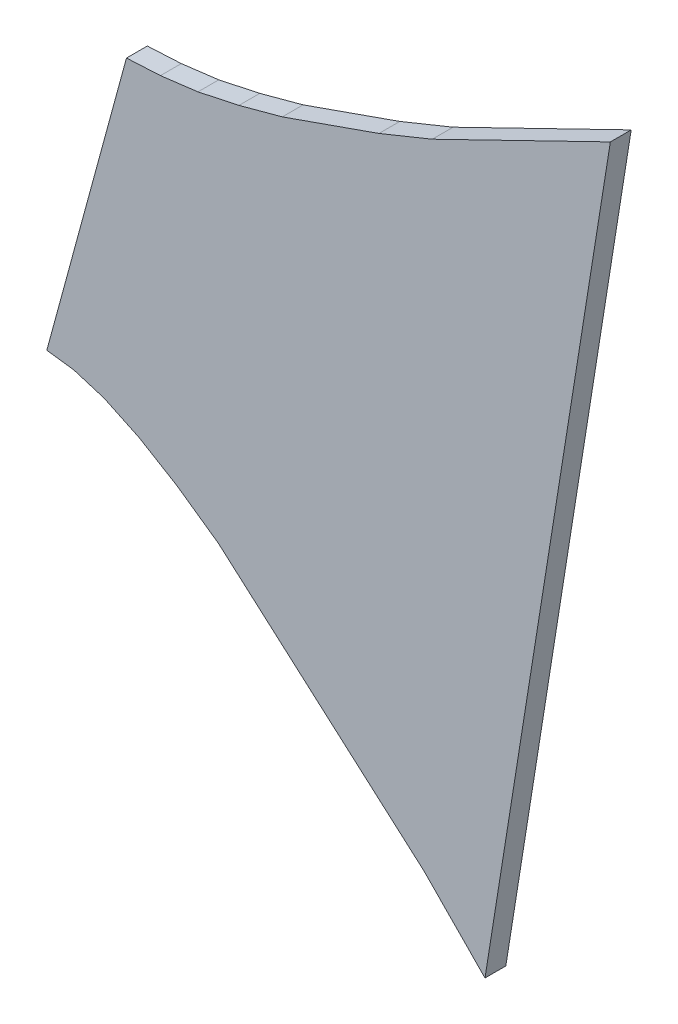
ISO-10303-21;
HEADER;
FILE_DESCRIPTION(('STEP AP214'),'2;1');
FILE_NAME('part.step','',(''),(''),'','','');
FILE_SCHEMA(('AUTOMOTIVE_DESIGN { 1 0 10303 214 1 1 1 1 }'));
ENDSEC;
DATA;
#1=APPLICATION_CONTEXT('core data for automotive mechanical design processes');
#2=APPLICATION_PROTOCOL_DEFINITION('international standard','automotive_design',2000,#1);
#3=PRODUCT_CONTEXT('',#1,'mechanical');
#4=PRODUCT('Part','Part','',(#3));
#5=PRODUCT_RELATED_PRODUCT_CATEGORY('part','',(#4));
#6=PRODUCT_DEFINITION_FORMATION('','',#4);
#7=PRODUCT_DEFINITION_CONTEXT('part definition',#1,'design');
#8=PRODUCT_DEFINITION('design','',#6,#7);
#9=PRODUCT_DEFINITION_SHAPE('','',#8);
#10=(LENGTH_UNIT() NAMED_UNIT(*) SI_UNIT(.MILLI.,.METRE.));
#11=(NAMED_UNIT(*) PLANE_ANGLE_UNIT() SI_UNIT($,.RADIAN.));
#12=(NAMED_UNIT(*) SI_UNIT($,.STERADIAN.) SOLID_ANGLE_UNIT());
#13=UNCERTAINTY_MEASURE_WITH_UNIT(LENGTH_MEASURE(1.E-05),#10,'distance_accuracy_value','');
#14=(GEOMETRIC_REPRESENTATION_CONTEXT(3) GLOBAL_UNCERTAINTY_ASSIGNED_CONTEXT((#13)) GLOBAL_UNIT_ASSIGNED_CONTEXT((#10,
#11,#12)) REPRESENTATION_CONTEXT('',''));
#15=CARTESIAN_POINT('',(0.,0.,0.));
#16=DIRECTION('',(0.,0.,1.));
#17=DIRECTION('',(1.,0.,0.));
#18=AXIS2_PLACEMENT_3D('',#15,#16,#17);
#19=CARTESIAN_POINT('',(115.94100189209,84.6029968261719,0.));
#20=DIRECTION('',(0.129275901381531,0.991608663395995,0.));
#21=DIRECTION('',(0.991608663395995,-0.129275901381531,0.));
#22=AXIS2_PLACEMENT_3D('',#19,#20,#21);
#23=PLANE('',#22);
#24=DIRECTION('',(0.991608663395995,-0.129275901381531,0.));
#25=VECTOR('',#24,1.);
#26=CARTESIAN_POINT('',(115.94100189209,84.6029968261719,0.03556));
#27=LINE('',#26,#25);
#28=CARTESIAN_POINT('',(115.94100189209,84.6029968261719,0.03556));
#29=VERTEX_POINT('',#28);
#30=CARTESIAN_POINT('',(115.986999511719,84.5970001220703,0.03556));
#31=VERTEX_POINT('',#30);
#32=EDGE_CURVE('E11',#29,#31,#27,.T.);
#33=ORIENTED_EDGE('',*,*,#32,.F.);
#34=DIRECTION('',(0.,0.,1.));
#35=VECTOR('',#34,1.);
#36=CARTESIAN_POINT('',(115.94100189209,84.6029968261719,0.));
#37=LINE('',#36,#35);
#38=CARTESIAN_POINT('',(115.94100189209,84.6029968261719,0.));
#39=VERTEX_POINT('',#38);
#40=EDGE_CURVE('E24',#39,#29,#37,.T.);
#41=ORIENTED_EDGE('',*,*,#40,.F.);
#42=DIRECTION('',(0.991608663395995,-0.129275901381531,0.));
#43=VECTOR('',#42,1.);
#44=CARTESIAN_POINT('',(115.94100189209,84.6029968261719,0.));
#45=LINE('',#44,#43);
#46=CARTESIAN_POINT('',(115.986999511719,84.5970001220703,0.));
#47=VERTEX_POINT('',#46);
#48=EDGE_CURVE('E148',#39,#47,#45,.T.);
#49=ORIENTED_EDGE('',*,*,#48,.T.);
#50=DIRECTION('',(0.,0.,1.));
#51=VECTOR('',#50,1.);
#52=CARTESIAN_POINT('',(115.986999511719,84.5970001220703,0.));
#53=LINE('',#52,#51);
#54=EDGE_CURVE('E37',#47,#31,#53,.T.);
#55=ORIENTED_EDGE('',*,*,#54,.T.);
#56=EDGE_LOOP('',(#33,#41,#49,#55));
#57=FACE_BOUND('',#56,.T.);
#58=ADVANCED_FACE('F17',(#57),#23,.F.);
#59=CARTESIAN_POINT('',(115.986999511719,84.5970001220703,0.));
#60=DIRECTION('',(0.294056287302321,0.955788104078501,0.));
#61=DIRECTION('',(0.955788104078501,-0.294056287302321,0.));
#62=AXIS2_PLACEMENT_3D('',#59,#60,#61);
#63=PLANE('',#62);
#64=DIRECTION('',(0.955788104078501,-0.294056287302321,0.));
#65=VECTOR('',#64,1.);
#66=CARTESIAN_POINT('',(115.986999511719,84.5970001220703,0.03556));
#67=LINE('',#66,#65);
#68=CARTESIAN_POINT('',(116.039001464844,84.5810012817383,0.03556));
#69=VERTEX_POINT('',#68);
#70=EDGE_CURVE('E252',#31,#69,#67,.T.);
#71=ORIENTED_EDGE('',*,*,#70,.F.);
#72=ORIENTED_EDGE('',*,*,#54,.F.);
#73=DIRECTION('',(0.955788104078501,-0.294056287302321,0.));
#74=VECTOR('',#73,1.);
#75=CARTESIAN_POINT('',(115.986999511719,84.5970001220703,0.));
#76=LINE('',#75,#74);
#77=CARTESIAN_POINT('',(116.039001464844,84.5810012817383,0.));
#78=VERTEX_POINT('',#77);
#79=EDGE_CURVE('E249',#47,#78,#76,.T.);
#80=ORIENTED_EDGE('',*,*,#79,.T.);
#81=DIRECTION('',(0.,0.,1.));
#82=VECTOR('',#81,1.);
#83=CARTESIAN_POINT('',(116.039001464844,84.5810012817383,0.));
#84=LINE('',#83,#82);
#85=EDGE_CURVE('E247',#78,#69,#84,.T.);
#86=ORIENTED_EDGE('',*,*,#85,.T.);
#87=EDGE_LOOP('',(#71,#72,#80,#86));
#88=FACE_BOUND('',#87,.T.);
#89=ADVANCED_FACE('F260',(#88),#63,.F.);
#90=CARTESIAN_POINT('',(116.039001464844,84.5810012817383,0.));
#91=DIRECTION('',(0.428754149049131,0.903421208337039,0.));
#92=DIRECTION('',(0.903421208337039,-0.428754149049131,0.));
#93=AXIS2_PLACEMENT_3D('',#90,#91,#92);
#94=PLANE('',#93);
#95=DIRECTION('',(0.903421208337039,-0.428754149049131,0.));
#96=VECTOR('',#95,1.);
#97=CARTESIAN_POINT('',(116.039001464844,84.5810012817383,0.03556));
#98=LINE('',#97,#96);
#99=CARTESIAN_POINT('',(116.097999572754,84.5530014038086,0.03556));
#100=VERTEX_POINT('',#99);
#101=EDGE_CURVE('E244',#69,#100,#98,.T.);
#102=ORIENTED_EDGE('',*,*,#101,.F.);
#103=ORIENTED_EDGE('',*,*,#85,.F.);
#104=DIRECTION('',(0.903421208337039,-0.428754149049131,0.));
#105=VECTOR('',#104,1.);
#106=CARTESIAN_POINT('',(116.039001464844,84.5810012817383,0.));
#107=LINE('',#106,#105);
#108=CARTESIAN_POINT('',(116.097999572754,84.5530014038086,0.));
#109=VERTEX_POINT('',#108);
#110=EDGE_CURVE('E241',#78,#109,#107,.T.);
#111=ORIENTED_EDGE('',*,*,#110,.T.);
#112=DIRECTION('',(0.,0.,1.));
#113=VECTOR('',#112,1.);
#114=CARTESIAN_POINT('',(116.097999572754,84.5530014038086,0.));
#115=LINE('',#114,#113);
#116=EDGE_CURVE('E239',#109,#100,#115,.T.);
#117=ORIENTED_EDGE('',*,*,#116,.T.);
#118=EDGE_LOOP('',(#102,#103,#111,#117));
#119=FACE_BOUND('',#118,.T.);
#120=ADVANCED_FACE('F266',(#119),#94,.F.);
#121=CARTESIAN_POINT('',(116.097999572754,84.5530014038086,0.));
#122=DIRECTION('',(0.514495755427527,0.857492925712544,0.));
#123=DIRECTION('',(0.857492925712544,-0.514495755427527,0.));
#124=AXIS2_PLACEMENT_3D('',#121,#122,#123);
#125=PLANE('',#124);
#126=DIRECTION('',(0.857492925712544,-0.514495755427526,0.));
#127=VECTOR('',#126,1.);
#128=CARTESIAN_POINT('',(116.097999572754,84.5530014038086,0.03556));
#129=LINE('',#128,#127);
#130=CARTESIAN_POINT('',(116.16300201416,84.5139999389648,0.03556));
#131=VERTEX_POINT('',#130);
#132=EDGE_CURVE('E236',#100,#131,#129,.T.);
#133=ORIENTED_EDGE('',*,*,#132,.F.);
#134=ORIENTED_EDGE('',*,*,#116,.F.);
#135=DIRECTION('',(0.857492925712544,-0.514495755427526,0.));
#136=VECTOR('',#135,1.);
#137=CARTESIAN_POINT('',(116.097999572754,84.5530014038086,0.));
#138=LINE('',#137,#136);
#139=CARTESIAN_POINT('',(116.16300201416,84.5139999389648,0.));
#140=VERTEX_POINT('',#139);
#141=EDGE_CURVE('E233',#109,#140,#138,.T.);
#142=ORIENTED_EDGE('',*,*,#141,.T.);
#143=DIRECTION('',(0.,0.,1.));
#144=VECTOR('',#143,1.);
#145=CARTESIAN_POINT('',(116.16300201416,84.5139999389648,0.));
#146=LINE('',#145,#144);
#147=EDGE_CURVE('E231',#140,#131,#146,.T.);
#148=ORIENTED_EDGE('',*,*,#147,.T.);
#149=EDGE_LOOP('',(#133,#134,#142,#148));
#150=FACE_BOUND('',#149,.T.);
#151=ADVANCED_FACE('F268',(#150),#125,.F.);
#152=CARTESIAN_POINT('',(116.16300201416,84.5139999389648,0.));
#153=DIRECTION('',(0.575806743050347,0.817585833205146,0.));
#154=DIRECTION('',(0.817585833205146,-0.575806743050347,0.));
#155=AXIS2_PLACEMENT_3D('',#152,#153,#154);
#156=PLANE('',#155);
#157=DIRECTION('',(0.817585833205146,-0.575806743050347,0.));
#158=VECTOR('',#157,1.);
#159=CARTESIAN_POINT('',(116.16300201416,84.5139999389648,0.03556));
#160=LINE('',#159,#158);
#161=CARTESIAN_POINT('',(116.234001159668,84.463996887207,0.03556));
#162=VERTEX_POINT('',#161);
#163=EDGE_CURVE('E228',#131,#162,#160,.T.);
#164=ORIENTED_EDGE('',*,*,#163,.F.);
#165=ORIENTED_EDGE('',*,*,#147,.F.);
#166=DIRECTION('',(0.817585833205146,-0.575806743050347,0.));
#167=VECTOR('',#166,1.);
#168=CARTESIAN_POINT('',(116.16300201416,84.5139999389648,0.));
#169=LINE('',#168,#167);
#170=CARTESIAN_POINT('',(116.234001159668,84.463996887207,0.));
#171=VERTEX_POINT('',#170);
#172=EDGE_CURVE('E225',#140,#171,#169,.T.);
#173=ORIENTED_EDGE('',*,*,#172,.T.);
#174=DIRECTION('',(0.,0.,1.));
#175=VECTOR('',#174,1.);
#176=CARTESIAN_POINT('',(116.234001159668,84.463996887207,0.));
#177=LINE('',#176,#175);
#178=EDGE_CURVE('E223',#171,#162,#177,.T.);
#179=ORIENTED_EDGE('',*,*,#178,.T.);
#180=EDGE_LOOP('',(#164,#165,#173,#179));
#181=FACE_BOUND('',#180,.T.);
#182=ADVANCED_FACE('F273',(#181),#156,.F.);
#183=CARTESIAN_POINT('',(116.234001159668,84.463996887207,0.));
#184=DIRECTION('',(0.660772422356087,0.750586308064348,0.));
#185=DIRECTION('',(0.750586308064348,-0.660772422356087,0.));
#186=AXIS2_PLACEMENT_3D('',#183,#184,#185);
#187=PLANE('',#186);
#188=DIRECTION('',(0.750586308064348,-0.660772422356087,0.));
#189=VECTOR('',#188,1.);
#190=CARTESIAN_POINT('',(116.234001159668,84.463996887207,0.03556));
#191=LINE('',#190,#189);
#192=CARTESIAN_POINT('',(116.584999084473,84.1549987792969,0.03556));
#193=VERTEX_POINT('',#192);
#194=EDGE_CURVE('E220',#162,#193,#191,.T.);
#195=ORIENTED_EDGE('',*,*,#194,.F.);
#196=ORIENTED_EDGE('',*,*,#178,.F.);
#197=DIRECTION('',(0.750586308064348,-0.660772422356087,0.));
#198=VECTOR('',#197,1.);
#199=CARTESIAN_POINT('',(116.234001159668,84.463996887207,0.));
#200=LINE('',#199,#198);
#201=CARTESIAN_POINT('',(116.584999084473,84.1549987792969,0.));
#202=VERTEX_POINT('',#201);
#203=EDGE_CURVE('E217',#171,#202,#200,.T.);
#204=ORIENTED_EDGE('',*,*,#203,.T.);
#205=DIRECTION('',(0.,0.,1.));
#206=VECTOR('',#205,1.);
#207=CARTESIAN_POINT('',(116.584999084473,84.1549987792969,0.));
#208=LINE('',#207,#206);
#209=EDGE_CURVE('E215',#202,#193,#208,.T.);
#210=ORIENTED_EDGE('',*,*,#209,.T.);
#211=EDGE_LOOP('',(#195,#196,#204,#210));
#212=FACE_BOUND('',#211,.T.);
#213=ADVANCED_FACE('F276',(#212),#187,.F.);
#214=CARTESIAN_POINT('',(116.584999084473,84.1549987792969,0.));
#215=DIRECTION('',(0.713779683317167,0.700370304684346,0.));
#216=DIRECTION('',(0.700370304684346,-0.713779683317167,0.));
#217=AXIS2_PLACEMENT_3D('',#214,#215,#216);
#218=PLANE('',#217);
#219=DIRECTION('',(0.700370304684346,-0.713779683317167,0.));
#220=VECTOR('',#219,1.);
#221=CARTESIAN_POINT('',(116.584999084473,84.1549987792969,0.03556));
#222=LINE('',#221,#220);
#223=CARTESIAN_POINT('',(116.689002990723,84.0490036010742,0.03556));
#224=VERTEX_POINT('',#223);
#225=EDGE_CURVE('E212',#193,#224,#222,.T.);
#226=ORIENTED_EDGE('',*,*,#225,.F.);
#227=ORIENTED_EDGE('',*,*,#209,.F.);
#228=DIRECTION('',(0.700370304684346,-0.713779683317167,0.));
#229=VECTOR('',#228,1.);
#230=CARTESIAN_POINT('',(116.584999084473,84.1549987792969,0.));
#231=LINE('',#230,#229);
#232=CARTESIAN_POINT('',(116.689002990723,84.0490036010742,0.));
#233=VERTEX_POINT('',#232);
#234=EDGE_CURVE('E209',#202,#233,#231,.T.);
#235=ORIENTED_EDGE('',*,*,#234,.T.);
#236=DIRECTION('',(0.,0.,1.));
#237=VECTOR('',#236,1.);
#238=CARTESIAN_POINT('',(116.689002990723,84.0490036010742,0.));
#239=LINE('',#238,#237);
#240=EDGE_CURVE('E207',#233,#224,#239,.T.);
#241=ORIENTED_EDGE('',*,*,#240,.T.);
#242=EDGE_LOOP('',(#226,#227,#235,#241));
#243=FACE_BOUND('',#242,.T.);
#244=ADVANCED_FACE('F281',(#243),#218,.F.);
#245=CARTESIAN_POINT('',(116.689002990723,84.0490036010742,0.));
#246=DIRECTION('',(-0.987541638799069,0.15735790935968,0.));
#247=DIRECTION('',(0.15735790935968,0.987541638799069,0.));
#248=AXIS2_PLACEMENT_3D('',#245,#246,#247);
#249=PLANE('',#248);
#250=DIRECTION('',(0.15735790935968,0.987541638799069,0.));
#251=VECTOR('',#250,1.);
#252=CARTESIAN_POINT('',(116.689002990723,84.0490036010742,0.03556));
#253=LINE('',#252,#251);
#254=CARTESIAN_POINT('',(116.90299987793,85.3919982910156,0.03556));
#255=VERTEX_POINT('',#254);
#256=EDGE_CURVE('E204',#224,#255,#253,.T.);
#257=ORIENTED_EDGE('',*,*,#256,.F.);
#258=ORIENTED_EDGE('',*,*,#240,.F.);
#259=DIRECTION('',(0.15735790935968,0.987541638799069,0.));
#260=VECTOR('',#259,1.);
#261=CARTESIAN_POINT('',(116.689002990723,84.0490036010742,0.));
#262=LINE('',#261,#260);
#263=CARTESIAN_POINT('',(116.90299987793,85.3919982910156,0.));
#264=VERTEX_POINT('',#263);
#265=EDGE_CURVE('E201',#233,#264,#262,.T.);
#266=ORIENTED_EDGE('',*,*,#265,.T.);
#267=DIRECTION('',(0.,0.,1.));
#268=VECTOR('',#267,1.);
#269=CARTESIAN_POINT('',(116.90299987793,85.3919982910156,0.));
#270=LINE('',#269,#268);
#271=EDGE_CURVE('E199',#264,#255,#270,.T.);
#272=ORIENTED_EDGE('',*,*,#271,.T.);
#273=EDGE_LOOP('',(#257,#258,#266,#272));
#274=FACE_BOUND('',#273,.T.);
#275=ADVANCED_FACE('F284',(#274),#249,.F.);
#276=CARTESIAN_POINT('',(116.90299987793,85.3919982910156,0.));
#277=DIRECTION('',(0.437711289267572,-0.899115580583342,0.));
#278=DIRECTION('',(-0.899115580583342,-0.437711289267572,0.));
#279=AXIS2_PLACEMENT_3D('',#276,#277,#278);
#280=PLANE('',#279);
#281=DIRECTION('',(-0.899115580583342,-0.437711289267572,0.));
#282=VECTOR('',#281,1.);
#283=CARTESIAN_POINT('',(116.90299987793,85.3919982910156,0.03556));
#284=LINE('',#283,#282);
#285=CARTESIAN_POINT('',(116.598999023438,85.2440032958984,0.03556));
#286=VERTEX_POINT('',#285);
#287=EDGE_CURVE('E196',#255,#286,#284,.T.);
#288=ORIENTED_EDGE('',*,*,#287,.F.);
#289=ORIENTED_EDGE('',*,*,#271,.F.);
#290=DIRECTION('',(-0.899115580583342,-0.437711289267572,0.));
#291=VECTOR('',#290,1.);
#292=CARTESIAN_POINT('',(116.90299987793,85.3919982910156,0.));
#293=LINE('',#292,#291);
#294=CARTESIAN_POINT('',(116.598999023438,85.2440032958984,0.));
#295=VERTEX_POINT('',#294);
#296=EDGE_CURVE('E193',#264,#295,#293,.T.);
#297=ORIENTED_EDGE('',*,*,#296,.T.);
#298=DIRECTION('',(0.,0.,1.));
#299=VECTOR('',#298,1.);
#300=CARTESIAN_POINT('',(116.598999023438,85.2440032958984,0.));
#301=LINE('',#300,#299);
#302=EDGE_CURVE('E191',#295,#286,#301,.T.);
#303=ORIENTED_EDGE('',*,*,#302,.T.);
#304=EDGE_LOOP('',(#288,#289,#297,#303));
#305=FACE_BOUND('',#304,.T.);
#306=ADVANCED_FACE('F289',(#305),#280,.F.);
#307=CARTESIAN_POINT('',(116.598999023438,85.2440032958984,0.));
#308=DIRECTION('',(0.376687435469683,-0.926340421205549,0.));
#309=DIRECTION('',(-0.926340421205549,-0.376687435469683,0.));
#310=AXIS2_PLACEMENT_3D('',#307,#308,#309);
#311=PLANE('',#310);
#312=DIRECTION('',(-0.926340421205549,-0.376687435469683,0.));
#313=VECTOR('',#312,1.);
#314=CARTESIAN_POINT('',(116.598999023438,85.2440032958984,0.03556));
#315=LINE('',#314,#313);
#316=CARTESIAN_POINT('',(116.508003234863,85.2070007324219,0.03556));
#317=VERTEX_POINT('',#316);
#318=EDGE_CURVE('E188',#286,#317,#315,.T.);
#319=ORIENTED_EDGE('',*,*,#318,.F.);
#320=ORIENTED_EDGE('',*,*,#302,.F.);
#321=DIRECTION('',(-0.926340421205549,-0.376687435469683,0.));
#322=VECTOR('',#321,1.);
#323=CARTESIAN_POINT('',(116.598999023438,85.2440032958984,0.));
#324=LINE('',#323,#322);
#325=CARTESIAN_POINT('',(116.508003234863,85.2070007324219,0.));
#326=VERTEX_POINT('',#325);
#327=EDGE_CURVE('E185',#295,#326,#324,.T.);
#328=ORIENTED_EDGE('',*,*,#327,.T.);
#329=DIRECTION('',(0.,0.,1.));
#330=VECTOR('',#329,1.);
#331=CARTESIAN_POINT('',(116.508003234863,85.2070007324219,0.));
#332=LINE('',#331,#330);
#333=EDGE_CURVE('E183',#326,#317,#332,.T.);
#334=ORIENTED_EDGE('',*,*,#333,.T.);
#335=EDGE_LOOP('',(#319,#320,#328,#334));
#336=FACE_BOUND('',#335,.T.);
#337=ADVANCED_FACE('F292',(#336),#311,.F.);
#338=CARTESIAN_POINT('',(116.508003234863,85.2070007324219,0.));
#339=DIRECTION('',(0.331615071297346,-0.943414778604012,0.));
#340=DIRECTION('',(-0.943414778604012,-0.331615071297346,0.));
#341=AXIS2_PLACEMENT_3D('',#338,#339,#340);
#342=PLANE('',#341);
#343=DIRECTION('',(-0.943414778604012,-0.331615071297346,0.));
#344=VECTOR('',#343,1.);
#345=CARTESIAN_POINT('',(116.508003234863,85.2070007324219,0.03556));
#346=LINE('',#345,#344);
#347=CARTESIAN_POINT('',(116.343002319336,85.1490020751953,0.03556));
#348=VERTEX_POINT('',#347);
#349=EDGE_CURVE('E180',#317,#348,#346,.T.);
#350=ORIENTED_EDGE('',*,*,#349,.F.);
#351=ORIENTED_EDGE('',*,*,#333,.F.);
#352=DIRECTION('',(-0.943414778604012,-0.331615071297346,0.));
#353=VECTOR('',#352,1.);
#354=CARTESIAN_POINT('',(116.508003234863,85.2070007324219,0.));
#355=LINE('',#354,#353);
#356=CARTESIAN_POINT('',(116.343002319336,85.1490020751953,0.));
#357=VERTEX_POINT('',#356);
#358=EDGE_CURVE('E177',#326,#357,#355,.T.);
#359=ORIENTED_EDGE('',*,*,#358,.T.);
#360=DIRECTION('',(0.,0.,1.));
#361=VECTOR('',#360,1.);
#362=CARTESIAN_POINT('',(116.343002319336,85.1490020751953,0.));
#363=LINE('',#362,#361);
#364=EDGE_CURVE('E175',#357,#348,#363,.T.);
#365=ORIENTED_EDGE('',*,*,#364,.T.);
#366=EDGE_LOOP('',(#350,#351,#359,#365));
#367=FACE_BOUND('',#366,.T.);
#368=ADVANCED_FACE('F297',(#367),#342,.F.);
#369=CARTESIAN_POINT('',(116.343002319336,85.1490020751953,0.));
#370=DIRECTION('',(0.260944118155604,-0.965353907745752,0.));
#371=DIRECTION('',(-0.965353907745752,-0.260944118155604,0.));
#372=AXIS2_PLACEMENT_3D('',#369,#370,#371);
#373=PLANE('',#372);
#374=DIRECTION('',(-0.965353907745752,-0.260944118155604,0.));
#375=VECTOR('',#374,1.);
#376=CARTESIAN_POINT('',(116.343002319336,85.1490020751953,0.03556));
#377=LINE('',#376,#375);
#378=CARTESIAN_POINT('',(116.268997192383,85.1289978027344,0.03556));
#379=VERTEX_POINT('',#378);
#380=EDGE_CURVE('E172',#348,#379,#377,.T.);
#381=ORIENTED_EDGE('',*,*,#380,.F.);
#382=ORIENTED_EDGE('',*,*,#364,.F.);
#383=DIRECTION('',(-0.965353907745752,-0.260944118155604,0.));
#384=VECTOR('',#383,1.);
#385=CARTESIAN_POINT('',(116.343002319336,85.1490020751953,0.));
#386=LINE('',#385,#384);
#387=CARTESIAN_POINT('',(116.268997192383,85.1289978027344,0.));
#388=VERTEX_POINT('',#387);
#389=EDGE_CURVE('E169',#357,#388,#386,.T.);
#390=ORIENTED_EDGE('',*,*,#389,.T.);
#391=DIRECTION('',(0.,0.,1.));
#392=VECTOR('',#391,1.);
#393=CARTESIAN_POINT('',(116.268997192383,85.1289978027344,0.));
#394=LINE('',#393,#392);
#395=EDGE_CURVE('E167',#388,#379,#394,.T.);
#396=ORIENTED_EDGE('',*,*,#395,.T.);
#397=EDGE_LOOP('',(#381,#382,#390,#396));
#398=FACE_BOUND('',#397,.T.);
#399=ADVANCED_FACE('F300',(#398),#373,.F.);
#400=CARTESIAN_POINT('',(116.268997192383,85.1289978027344,0.));
#401=DIRECTION('',(0.209521810593545,-0.977803973649935,0.));
#402=DIRECTION('',(-0.977803973649935,-0.209521810593545,0.));
#403=AXIS2_PLACEMENT_3D('',#400,#401,#402);
#404=PLANE('',#403);
#405=DIRECTION('',(-0.977803973649935,-0.209521810593545,0.));
#406=VECTOR('',#405,1.);
#407=CARTESIAN_POINT('',(116.268997192383,85.1289978027344,0.03556));
#408=LINE('',#407,#406);
#409=CARTESIAN_POINT('',(116.198997497559,85.1139984130859,0.03556));
#410=VERTEX_POINT('',#409);
#411=EDGE_CURVE('E164',#379,#410,#408,.T.);
#412=ORIENTED_EDGE('',*,*,#411,.F.);
#413=ORIENTED_EDGE('',*,*,#395,.F.);
#414=DIRECTION('',(-0.977803973649935,-0.209521810593545,0.));
#415=VECTOR('',#414,1.);
#416=CARTESIAN_POINT('',(116.268997192383,85.1289978027344,0.));
#417=LINE('',#416,#415);
#418=CARTESIAN_POINT('',(116.198997497559,85.1139984130859,0.));
#419=VERTEX_POINT('',#418);
#420=EDGE_CURVE('E161',#388,#419,#417,.T.);
#421=ORIENTED_EDGE('',*,*,#420,.T.);
#422=DIRECTION('',(0.,0.,1.));
#423=VECTOR('',#422,1.);
#424=CARTESIAN_POINT('',(116.198997497559,85.1139984130859,0.));
#425=LINE('',#424,#423);
#426=EDGE_CURVE('E159',#419,#410,#425,.T.);
#427=ORIENTED_EDGE('',*,*,#426,.T.);
#428=EDGE_LOOP('',(#412,#413,#421,#427));
#429=FACE_BOUND('',#428,.T.);
#430=ADVANCED_FACE('F305',(#429),#404,.F.);
#431=CARTESIAN_POINT('',(116.198997497559,85.1139984130859,0.));
#432=DIRECTION('',(0.123976495270336,-0.992285154892728,0.));
#433=DIRECTION('',(-0.992285154892728,-0.123976495270336,0.));
#434=AXIS2_PLACEMENT_3D('',#431,#432,#433);
#435=PLANE('',#434);
#436=DIRECTION('',(-0.992285154892728,-0.123976495270336,0.));
#437=VECTOR('',#436,1.);
#438=CARTESIAN_POINT('',(116.198997497559,85.1139984130859,0.03556));
#439=LINE('',#438,#437);
#440=CARTESIAN_POINT('',(116.13500213623,85.1060028076172,0.03556));
#441=VERTEX_POINT('',#440);
#442=EDGE_CURVE('E156',#410,#441,#439,.T.);
#443=ORIENTED_EDGE('',*,*,#442,.F.);
#444=ORIENTED_EDGE('',*,*,#426,.F.);
#445=DIRECTION('',(-0.992285154892728,-0.123976495270336,0.));
#446=VECTOR('',#445,1.);
#447=CARTESIAN_POINT('',(116.198997497559,85.1139984130859,0.));
#448=LINE('',#447,#446);
#449=CARTESIAN_POINT('',(116.13500213623,85.1060028076172,0.));
#450=VERTEX_POINT('',#449);
#451=EDGE_CURVE('E154',#419,#450,#448,.T.);
#452=ORIENTED_EDGE('',*,*,#451,.T.);
#453=DIRECTION('',(0.,0.,1.));
#454=VECTOR('',#453,1.);
#455=CARTESIAN_POINT('',(116.13500213623,85.1060028076172,0.));
#456=LINE('',#455,#454);
#457=EDGE_CURVE('E139',#450,#441,#456,.T.);
#458=ORIENTED_EDGE('',*,*,#457,.T.);
#459=EDGE_LOOP('',(#443,#444,#452,#458));
#460=FACE_BOUND('',#459,.T.);
#461=ADVANCED_FACE('F307',(#460),#435,.F.);
#462=CARTESIAN_POINT('',(116.13500213623,85.1060028076172,0.));
#463=DIRECTION('',(0.0517589955688711,-0.998659604859284,0.));
#464=DIRECTION('',(-0.998659604859284,-0.0517589955688711,0.));
#465=AXIS2_PLACEMENT_3D('',#462,#463,#464);
#466=PLANE('',#465);
#467=DIRECTION('',(-0.998659604859284,-0.0517589955688711,0.));
#468=VECTOR('',#467,1.);
#469=CARTESIAN_POINT('',(116.13500213623,85.1060028076172,0.03556));
#470=LINE('',#469,#468);
#471=CARTESIAN_POINT('',(116.077003479004,85.1029968261719,0.03556));
#472=VERTEX_POINT('',#471);
#473=EDGE_CURVE('E143',#441,#472,#470,.T.);
#474=ORIENTED_EDGE('',*,*,#473,.F.);
#475=ORIENTED_EDGE('',*,*,#457,.F.);
#476=DIRECTION('',(-0.998659604859284,-0.0517589955688711,0.));
#477=VECTOR('',#476,1.);
#478=CARTESIAN_POINT('',(116.13500213623,85.1060028076172,0.));
#479=LINE('',#478,#477);
#480=CARTESIAN_POINT('',(116.077003479004,85.1029968261719,0.));
#481=VERTEX_POINT('',#480);
#482=EDGE_CURVE('E135',#450,#481,#479,.T.);
#483=ORIENTED_EDGE('',*,*,#482,.T.);
#484=DIRECTION('',(0.,0.,1.));
#485=VECTOR('',#484,1.);
#486=CARTESIAN_POINT('',(116.077003479004,85.1029968261719,0.));
#487=LINE('',#486,#485);
#488=EDGE_CURVE('E125',#481,#472,#487,.T.);
#489=ORIENTED_EDGE('',*,*,#488,.T.);
#490=EDGE_LOOP('',(#474,#475,#483,#489));
#491=FACE_BOUND('',#490,.T.);
#492=ADVANCED_FACE('F138',(#491),#466,.F.);
#493=CARTESIAN_POINT('',(116.077003479004,85.1029968261719,0.));
#494=DIRECTION('',(0.964940967572482,-0.262467005736497,0.));
#495=DIRECTION('',(-0.262467005736497,-0.964940967572482,0.));
#496=AXIS2_PLACEMENT_3D('',#493,#494,#495);
#497=PLANE('',#496);
#498=DIRECTION('',(-0.262467005736497,-0.964940967572482,0.));
#499=VECTOR('',#498,1.);
#500=CARTESIAN_POINT('',(116.077003479004,85.1029968261719,0.03556));
#501=LINE('',#500,#499);
#502=EDGE_CURVE('E131',#472,#29,#501,.T.);
#503=ORIENTED_EDGE('',*,*,#502,.F.);
#504=ORIENTED_EDGE('',*,*,#488,.F.);
#505=DIRECTION('',(-0.262467005736497,-0.964940967572482,0.));
#506=VECTOR('',#505,1.);
#507=CARTESIAN_POINT('',(116.077003479004,85.1029968261719,0.));
#508=LINE('',#507,#506);
#509=EDGE_CURVE('E129',#481,#39,#508,.T.);
#510=ORIENTED_EDGE('',*,*,#509,.T.);
#511=ORIENTED_EDGE('',*,*,#40,.T.);
#512=EDGE_LOOP('',(#503,#504,#510,#511));
#513=FACE_BOUND('',#512,.T.);
#514=ADVANCED_FACE('F127',(#513),#497,.F.);
#515=CARTESIAN_POINT('',(115.94100189209,84.6029968261719,0.));
#516=DIRECTION('',(0.,0.,1.));
#517=DIRECTION('',(1.,0.,0.));
#518=AXIS2_PLACEMENT_3D('',#515,#516,#517);
#519=PLANE('',#518);
#520=ORIENTED_EDGE('',*,*,#509,.F.);
#521=ORIENTED_EDGE('',*,*,#482,.F.);
#522=ORIENTED_EDGE('',*,*,#451,.F.);
#523=ORIENTED_EDGE('',*,*,#420,.F.);
#524=ORIENTED_EDGE('',*,*,#389,.F.);
#525=ORIENTED_EDGE('',*,*,#358,.F.);
#526=ORIENTED_EDGE('',*,*,#327,.F.);
#527=ORIENTED_EDGE('',*,*,#296,.F.);
#528=ORIENTED_EDGE('',*,*,#265,.F.);
#529=ORIENTED_EDGE('',*,*,#234,.F.);
#530=ORIENTED_EDGE('',*,*,#203,.F.);
#531=ORIENTED_EDGE('',*,*,#172,.F.);
#532=ORIENTED_EDGE('',*,*,#141,.F.);
#533=ORIENTED_EDGE('',*,*,#110,.F.);
#534=ORIENTED_EDGE('',*,*,#79,.F.);
#535=ORIENTED_EDGE('',*,*,#48,.F.);
#536=EDGE_LOOP('',(#520,#521,#522,#523,#524,#525,#526,#527,#528,#529,#530,#531,#532,#533,#534,#535));
#537=FACE_BOUND('',#536,.T.);
#538=ADVANCED_FACE('F146',(#537),#519,.F.);
#539=CARTESIAN_POINT('',(115.94100189209,84.6029968261719,0.03556));
#540=DIRECTION('',(0.,0.,1.));
#541=DIRECTION('',(1.,0.,0.));
#542=AXIS2_PLACEMENT_3D('',#539,#540,#541);
#543=PLANE('',#542);
#544=ORIENTED_EDGE('',*,*,#32,.T.);
#545=ORIENTED_EDGE('',*,*,#70,.T.);
#546=ORIENTED_EDGE('',*,*,#101,.T.);
#547=ORIENTED_EDGE('',*,*,#132,.T.);
#548=ORIENTED_EDGE('',*,*,#163,.T.);
#549=ORIENTED_EDGE('',*,*,#194,.T.);
#550=ORIENTED_EDGE('',*,*,#225,.T.);
#551=ORIENTED_EDGE('',*,*,#256,.T.);
#552=ORIENTED_EDGE('',*,*,#287,.T.);
#553=ORIENTED_EDGE('',*,*,#318,.T.);
#554=ORIENTED_EDGE('',*,*,#349,.T.);
#555=ORIENTED_EDGE('',*,*,#380,.T.);
#556=ORIENTED_EDGE('',*,*,#411,.T.);
#557=ORIENTED_EDGE('',*,*,#442,.T.);
#558=ORIENTED_EDGE('',*,*,#473,.T.);
#559=ORIENTED_EDGE('',*,*,#502,.T.);
#560=EDGE_LOOP('',(#544,#545,#546,#547,#548,#549,#550,#551,#552,#553,#554,#555,#556,#557,#558,#559));
#561=FACE_BOUND('',#560,.T.);
#562=ADVANCED_FACE('F263',(#561),#543,.T.);
#563=CLOSED_SHELL('',(#58,#89,#120,#151,#182,#213,#244,#275,#306,#337,#368,#399,#430,#461,#492,
#514,#538,#562));
#564=MANIFOLD_SOLID_BREP('B1',#563);
#565=ADVANCED_BREP_SHAPE_REPRESENTATION('',(#18,#564),#14);
#566=SHAPE_DEFINITION_REPRESENTATION(#9,#565);
ENDSEC;
END-ISO-10303-21;
